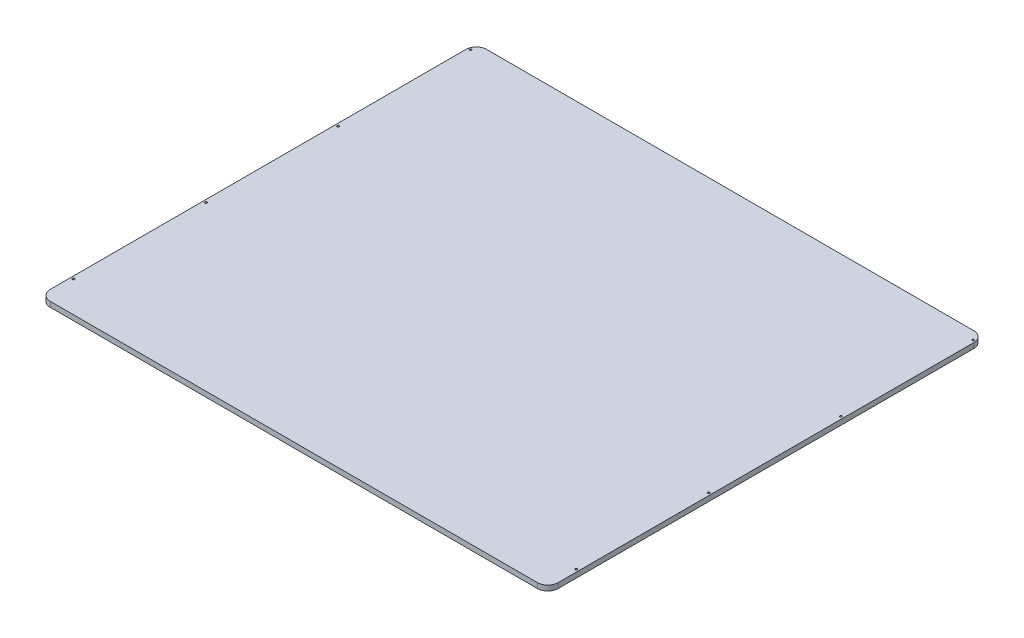
ISO-10303-21;
HEADER;
FILE_DESCRIPTION(('STEP AP214'),'2;1');
FILE_NAME('part.step','',(''),(''),'','','');
FILE_SCHEMA(('AUTOMOTIVE_DESIGN { 1 0 10303 214 1 1 1 1 }'));
ENDSEC;
DATA;
#1=APPLICATION_CONTEXT('core data for automotive mechanical design processes');
#2=APPLICATION_PROTOCOL_DEFINITION('international standard','automotive_design',2000,#1);
#3=PRODUCT_CONTEXT('',#1,'mechanical');
#4=PRODUCT('Part','Part','',(#3));
#5=PRODUCT_RELATED_PRODUCT_CATEGORY('part','',(#4));
#6=PRODUCT_DEFINITION_FORMATION('','',#4);
#7=PRODUCT_DEFINITION_CONTEXT('part definition',#1,'design');
#8=PRODUCT_DEFINITION('design','',#6,#7);
#9=PRODUCT_DEFINITION_SHAPE('','',#8);
#10=(LENGTH_UNIT() NAMED_UNIT(*) SI_UNIT(.MILLI.,.METRE.));
#11=(NAMED_UNIT(*) PLANE_ANGLE_UNIT() SI_UNIT($,.RADIAN.));
#12=(NAMED_UNIT(*) SI_UNIT($,.STERADIAN.) SOLID_ANGLE_UNIT());
#13=UNCERTAINTY_MEASURE_WITH_UNIT(LENGTH_MEASURE(1.E-05),#10,'distance_accuracy_value','');
#14=(GEOMETRIC_REPRESENTATION_CONTEXT(3) GLOBAL_UNCERTAINTY_ASSIGNED_CONTEXT((#13)) GLOBAL_UNIT_ASSIGNED_CONTEXT((#10,
#11,#12)) REPRESENTATION_CONTEXT('',''));
#15=CARTESIAN_POINT('',(0.,0.,0.));
#16=DIRECTION('',(0.,0.,1.));
#17=DIRECTION('',(1.,0.,0.));
#18=AXIS2_PLACEMENT_3D('',#15,#16,#17);
#19=CARTESIAN_POINT('',(0.,0.,0.));
#20=DIRECTION('',(0.,1.,0.));
#21=DIRECTION('',(0.,0.,1.));
#22=AXIS2_PLACEMENT_3D('',#19,#20,#21);
#23=PLANE('',#22);
#24=CARTESIAN_POINT('',(242.5,0.,-74.84));
#25=DIRECTION('',(0.,-1.,0.));
#26=DIRECTION('',(0.,0.,-1.));
#27=AXIS2_PLACEMENT_3D('',#24,#25,#26);
#28=CIRCLE('',#27,1.025);
#29=CARTESIAN_POINT('',(242.5,0.,-75.865));
#30=VERTEX_POINT('',#29);
#31=EDGE_CURVE('E218',#30,#30,#28,.T.);
#32=ORIENTED_EDGE('',*,*,#31,.F.);
#33=EDGE_LOOP('',(#32));
#34=FACE_BOUND('',#33,.T.);
#35=CARTESIAN_POINT('',(242.5,0.,52.83));
#36=DIRECTION('',(0.,-1.,0.));
#37=DIRECTION('',(0.,0.,-1.));
#38=AXIS2_PLACEMENT_3D('',#35,#36,#37);
#39=CIRCLE('',#38,1.025);
#40=CARTESIAN_POINT('',(242.5,0.,51.805));
#41=VERTEX_POINT('',#40);
#42=EDGE_CURVE('E212',#41,#41,#39,.T.);
#43=ORIENTED_EDGE('',*,*,#42,.F.);
#44=EDGE_LOOP('',(#43));
#45=FACE_BOUND('',#44,.T.);
#46=CARTESIAN_POINT('',(242.5,0.,180.5));
#47=DIRECTION('',(0.,-1.,0.));
#48=DIRECTION('',(0.,0.,-1.));
#49=AXIS2_PLACEMENT_3D('',#46,#47,#48);
#50=CIRCLE('',#49,1.025);
#51=CARTESIAN_POINT('',(242.5,0.,179.475));
#52=VERTEX_POINT('',#51);
#53=EDGE_CURVE('E206',#52,#52,#50,.T.);
#54=ORIENTED_EDGE('',*,*,#53,.F.);
#55=EDGE_LOOP('',(#54));
#56=FACE_BOUND('',#55,.T.);
#57=CARTESIAN_POINT('',(-242.5,0.,-202.51));
#58=DIRECTION('',(0.,-1.,0.));
#59=DIRECTION('',(0.,0.,-1.));
#60=AXIS2_PLACEMENT_3D('',#57,#58,#59);
#61=CIRCLE('',#60,1.025);
#62=CARTESIAN_POINT('',(-242.5,0.,-203.535));
#63=VERTEX_POINT('',#62);
#64=EDGE_CURVE('E200',#63,#63,#61,.T.);
#65=ORIENTED_EDGE('',*,*,#64,.F.);
#66=EDGE_LOOP('',(#65));
#67=FACE_BOUND('',#66,.T.);
#68=CARTESIAN_POINT('',(-242.5,0.,-74.84));
#69=DIRECTION('',(0.,-1.,0.));
#70=DIRECTION('',(0.,0.,-1.));
#71=AXIS2_PLACEMENT_3D('',#68,#69,#70);
#72=CIRCLE('',#71,1.025);
#73=CARTESIAN_POINT('',(-242.5,0.,-75.865));
#74=VERTEX_POINT('',#73);
#75=EDGE_CURVE('E194',#74,#74,#72,.T.);
#76=ORIENTED_EDGE('',*,*,#75,.F.);
#77=EDGE_LOOP('',(#76));
#78=FACE_BOUND('',#77,.T.);
#79=CARTESIAN_POINT('',(-242.5,0.,180.5));
#80=DIRECTION('',(0.,-1.,0.));
#81=DIRECTION('',(0.,0.,-1.));
#82=AXIS2_PLACEMENT_3D('',#79,#80,#81);
#83=CIRCLE('',#82,1.025);
#84=CARTESIAN_POINT('',(-242.5,0.,179.475));
#85=VERTEX_POINT('',#84);
#86=EDGE_CURVE('E177',#85,#85,#83,.T.);
#87=ORIENTED_EDGE('',*,*,#86,.F.);
#88=EDGE_LOOP('',(#87));
#89=FACE_BOUND('',#88,.T.);
#90=DIRECTION('',(0.,0.,-1.));
#91=VECTOR('',#90,1.);
#92=CARTESIAN_POINT('',(245.,0.,210.5));
#93=LINE('',#92,#91);
#94=CARTESIAN_POINT('',(245.,0.,200.5));
#95=VERTEX_POINT('',#94);
#96=CARTESIAN_POINT('',(245.,0.,-200.5));
#97=VERTEX_POINT('',#96);
#98=EDGE_CURVE('E118',#95,#97,#93,.T.);
#99=ORIENTED_EDGE('',*,*,#98,.F.);
#100=CARTESIAN_POINT('',(235.,0.,200.5));
#101=DIRECTION('',(0.,1.,0.));
#102=DIRECTION('',(0.,0.,1.));
#103=AXIS2_PLACEMENT_3D('',#100,#101,#102);
#104=CIRCLE('',#103,10.);
#105=CARTESIAN_POINT('',(235.,0.,210.5));
#106=VERTEX_POINT('',#105);
#107=EDGE_CURVE('E101',#95,#106,#104,.F.);
#108=ORIENTED_EDGE('',*,*,#107,.T.);
#109=DIRECTION('',(1.,0.,0.));
#110=VECTOR('',#109,1.);
#111=CARTESIAN_POINT('',(245.,0.,210.5));
#112=LINE('',#111,#110);
#113=CARTESIAN_POINT('',(-235.,0.,210.5));
#114=VERTEX_POINT('',#113);
#115=EDGE_CURVE('E128',#114,#106,#112,.T.);
#116=ORIENTED_EDGE('',*,*,#115,.F.);
#117=CARTESIAN_POINT('',(-235.,0.,200.5));
#118=DIRECTION('',(0.,1.,0.));
#119=DIRECTION('',(0.,0.,1.));
#120=AXIS2_PLACEMENT_3D('',#117,#118,#119);
#121=CIRCLE('',#120,10.);
#122=CARTESIAN_POINT('',(-245.,0.,200.5));
#123=VERTEX_POINT('',#122);
#124=EDGE_CURVE('E112',#114,#123,#121,.F.);
#125=ORIENTED_EDGE('',*,*,#124,.T.);
#126=DIRECTION('',(0.,0.,1.));
#127=VECTOR('',#126,1.);
#128=CARTESIAN_POINT('',(-245.,0.,210.5));
#129=LINE('',#128,#127);
#130=CARTESIAN_POINT('',(-245.,0.,-200.5));
#131=VERTEX_POINT('',#130);
#132=EDGE_CURVE('E132',#131,#123,#129,.T.);
#133=ORIENTED_EDGE('',*,*,#132,.F.);
#134=CARTESIAN_POINT('',(-235.,0.,-200.5));
#135=DIRECTION('',(0.,1.,0.));
#136=DIRECTION('',(0.,0.,1.));
#137=AXIS2_PLACEMENT_3D('',#134,#135,#136);
#138=CIRCLE('',#137,10.);
#139=CARTESIAN_POINT('',(-235.,0.,-210.5));
#140=VERTEX_POINT('',#139);
#141=EDGE_CURVE('E121',#131,#140,#138,.F.);
#142=ORIENTED_EDGE('',*,*,#141,.T.);
#143=DIRECTION('',(-1.,0.,0.));
#144=VECTOR('',#143,1.);
#145=CARTESIAN_POINT('',(245.,0.,-210.5));
#146=LINE('',#145,#144);
#147=CARTESIAN_POINT('',(235.,0.,-210.5));
#148=VERTEX_POINT('',#147);
#149=EDGE_CURVE('E127',#148,#140,#146,.T.);
#150=ORIENTED_EDGE('',*,*,#149,.F.);
#151=CARTESIAN_POINT('',(235.,0.,-200.5));
#152=DIRECTION('',(0.,1.,0.));
#153=DIRECTION('',(0.,0.,1.));
#154=AXIS2_PLACEMENT_3D('',#151,#152,#153);
#155=CIRCLE('',#154,10.);
#156=EDGE_CURVE('E126',#148,#97,#155,.F.);
#157=ORIENTED_EDGE('',*,*,#156,.T.);
#158=EDGE_LOOP('',(#99,#108,#116,#125,#133,#142,#150,#157));
#159=FACE_BOUND('',#158,.T.);
#160=CARTESIAN_POINT('',(-242.5,0.,52.83));
#161=DIRECTION('',(0.,-1.,0.));
#162=DIRECTION('',(0.,0.,-1.));
#163=AXIS2_PLACEMENT_3D('',#160,#161,#162);
#164=CIRCLE('',#163,1.025);
#165=CARTESIAN_POINT('',(-242.5,0.,51.805));
#166=VERTEX_POINT('',#165);
#167=EDGE_CURVE('E188',#166,#166,#164,.T.);
#168=ORIENTED_EDGE('',*,*,#167,.F.);
#169=EDGE_LOOP('',(#168));
#170=FACE_BOUND('',#169,.T.);
#171=CARTESIAN_POINT('',(242.5,0.,-202.51));
#172=DIRECTION('',(0.,-1.,0.));
#173=DIRECTION('',(0.,0.,-1.));
#174=AXIS2_PLACEMENT_3D('',#171,#172,#173);
#175=CIRCLE('',#174,1.025);
#176=CARTESIAN_POINT('',(242.5,0.,-203.535));
#177=VERTEX_POINT('',#176);
#178=EDGE_CURVE('E224',#177,#177,#175,.T.);
#179=ORIENTED_EDGE('',*,*,#178,.F.);
#180=EDGE_LOOP('',(#179));
#181=FACE_BOUND('',#180,.T.);
#182=ADVANCED_FACE('F35',(#34,#45,#56,#67,#78,#89,#159,#170,#181),#23,.F.);
#183=CARTESIAN_POINT('',(-245.,5.,210.5));
#184=DIRECTION('',(1.,0.,0.));
#185=DIRECTION('',(0.,0.,-1.));
#186=AXIS2_PLACEMENT_3D('',#183,#184,#185);
#187=PLANE('',#186);
#188=ORIENTED_EDGE('',*,*,#132,.T.);
#189=DIRECTION('',(0.,-1.,0.));
#190=VECTOR('',#189,1.);
#191=CARTESIAN_POINT('',(-245.,5.,200.5));
#192=LINE('',#191,#190);
#193=CARTESIAN_POINT('',(-245.,5.,200.5));
#194=VERTEX_POINT('',#193);
#195=EDGE_CURVE('E154',#123,#194,#192,.F.);
#196=ORIENTED_EDGE('',*,*,#195,.T.);
#197=DIRECTION('',(0.,0.,1.));
#198=VECTOR('',#197,1.);
#199=CARTESIAN_POINT('',(-245.,5.,210.5));
#200=LINE('',#199,#198);
#201=CARTESIAN_POINT('',(-245.,5.,-200.5));
#202=VERTEX_POINT('',#201);
#203=EDGE_CURVE('E130',#202,#194,#200,.T.);
#204=ORIENTED_EDGE('',*,*,#203,.F.);
#205=DIRECTION('',(0.,-1.,0.));
#206=VECTOR('',#205,1.);
#207=CARTESIAN_POINT('',(-245.,5.,-200.5));
#208=LINE('',#207,#206);
#209=EDGE_CURVE('E151',#202,#131,#208,.T.);
#210=ORIENTED_EDGE('',*,*,#209,.T.);
#211=EDGE_LOOP('',(#188,#196,#204,#210));
#212=FACE_BOUND('',#211,.T.);
#213=ADVANCED_FACE('F160',(#212),#187,.F.);
#214=CARTESIAN_POINT('',(245.,5.,210.5));
#215=DIRECTION('',(0.,0.,-1.));
#216=DIRECTION('',(-1.,0.,0.));
#217=AXIS2_PLACEMENT_3D('',#214,#215,#216);
#218=PLANE('',#217);
#219=ORIENTED_EDGE('',*,*,#115,.T.);
#220=DIRECTION('',(0.,-1.,0.));
#221=VECTOR('',#220,1.);
#222=CARTESIAN_POINT('',(235.,5.,210.5));
#223=LINE('',#222,#221);
#224=CARTESIAN_POINT('',(235.,5.,210.5));
#225=VERTEX_POINT('',#224);
#226=EDGE_CURVE('E106',#106,#225,#223,.F.);
#227=ORIENTED_EDGE('',*,*,#226,.T.);
#228=DIRECTION('',(1.,0.,0.));
#229=VECTOR('',#228,1.);
#230=CARTESIAN_POINT('',(245.,5.,210.5));
#231=LINE('',#230,#229);
#232=CARTESIAN_POINT('',(-235.,5.,210.5));
#233=VERTEX_POINT('',#232);
#234=EDGE_CURVE('E169',#233,#225,#231,.T.);
#235=ORIENTED_EDGE('',*,*,#234,.F.);
#236=DIRECTION('',(0.,-1.,0.));
#237=VECTOR('',#236,1.);
#238=CARTESIAN_POINT('',(-235.,5.,210.5));
#239=LINE('',#238,#237);
#240=EDGE_CURVE('E111',#233,#114,#239,.T.);
#241=ORIENTED_EDGE('',*,*,#240,.T.);
#242=EDGE_LOOP('',(#219,#227,#235,#241));
#243=FACE_BOUND('',#242,.T.);
#244=ADVANCED_FACE('F174',(#243),#218,.F.);
#245=CARTESIAN_POINT('',(245.,5.,210.5));
#246=DIRECTION('',(-1.,0.,0.));
#247=DIRECTION('',(0.,0.,1.));
#248=AXIS2_PLACEMENT_3D('',#245,#246,#247);
#249=PLANE('',#248);
#250=DIRECTION('',(0.,0.,-1.));
#251=VECTOR('',#250,1.);
#252=CARTESIAN_POINT('',(245.,5.,210.5));
#253=LINE('',#252,#251);
#254=CARTESIAN_POINT('',(245.,5.,200.5));
#255=VERTEX_POINT('',#254);
#256=CARTESIAN_POINT('',(245.,5.,-200.5));
#257=VERTEX_POINT('',#256);
#258=EDGE_CURVE('E120',#255,#257,#253,.T.);
#259=ORIENTED_EDGE('',*,*,#258,.F.);
#260=DIRECTION('',(0.,-1.,0.));
#261=VECTOR('',#260,1.);
#262=CARTESIAN_POINT('',(245.,5.,200.5));
#263=LINE('',#262,#261);
#264=EDGE_CURVE('E105',#255,#95,#263,.T.);
#265=ORIENTED_EDGE('',*,*,#264,.T.);
#266=ORIENTED_EDGE('',*,*,#98,.T.);
#267=DIRECTION('',(0.,-1.,0.));
#268=VECTOR('',#267,1.);
#269=CARTESIAN_POINT('',(245.,5.,-200.5));
#270=LINE('',#269,#268);
#271=EDGE_CURVE('E122',#97,#257,#270,.F.);
#272=ORIENTED_EDGE('',*,*,#271,.T.);
#273=EDGE_LOOP('',(#259,#265,#266,#272));
#274=FACE_BOUND('',#273,.T.);
#275=ADVANCED_FACE('F117',(#274),#249,.F.);
#276=CARTESIAN_POINT('',(245.,5.,-210.5));
#277=DIRECTION('',(0.,0.,1.));
#278=DIRECTION('',(1.,0.,0.));
#279=AXIS2_PLACEMENT_3D('',#276,#277,#278);
#280=PLANE('',#279);
#281=DIRECTION('',(-1.,0.,0.));
#282=VECTOR('',#281,1.);
#283=CARTESIAN_POINT('',(245.,5.,-210.5));
#284=LINE('',#283,#282);
#285=CARTESIAN_POINT('',(235.,5.,-210.5));
#286=VERTEX_POINT('',#285);
#287=CARTESIAN_POINT('',(-235.,5.,-210.5));
#288=VERTEX_POINT('',#287);
#289=EDGE_CURVE('E136',#286,#288,#284,.T.);
#290=ORIENTED_EDGE('',*,*,#289,.F.);
#291=DIRECTION('',(0.,-1.,0.));
#292=VECTOR('',#291,1.);
#293=CARTESIAN_POINT('',(235.,5.,-210.5));
#294=LINE('',#293,#292);
#295=EDGE_CURVE('E11',#286,#148,#294,.T.);
#296=ORIENTED_EDGE('',*,*,#295,.T.);
#297=ORIENTED_EDGE('',*,*,#149,.T.);
#298=DIRECTION('',(0.,-1.,0.));
#299=VECTOR('',#298,1.);
#300=CARTESIAN_POINT('',(-235.,5.,-210.5));
#301=LINE('',#300,#299);
#302=EDGE_CURVE('E43',#140,#288,#301,.F.);
#303=ORIENTED_EDGE('',*,*,#302,.T.);
#304=EDGE_LOOP('',(#290,#296,#297,#303));
#305=FACE_BOUND('',#304,.T.);
#306=ADVANCED_FACE('F242',(#305),#280,.F.);
#307=CARTESIAN_POINT('',(0.,5.,0.));
#308=DIRECTION('',(0.,1.,0.));
#309=DIRECTION('',(0.,0.,1.));
#310=AXIS2_PLACEMENT_3D('',#307,#308,#309);
#311=PLANE('',#310);
#312=CARTESIAN_POINT('',(242.5,5.,-202.51));
#313=DIRECTION('',(0.,-1.,0.));
#314=DIRECTION('',(0.,0.,-1.));
#315=AXIS2_PLACEMENT_3D('',#312,#313,#314);
#316=CIRCLE('',#315,1.025);
#317=CARTESIAN_POINT('',(242.5,5.,-203.535));
#318=VERTEX_POINT('',#317);
#319=EDGE_CURVE('E221',#318,#318,#316,.T.);
#320=ORIENTED_EDGE('',*,*,#319,.T.);
#321=EDGE_LOOP('',(#320));
#322=FACE_BOUND('',#321,.T.);
#323=CARTESIAN_POINT('',(242.5,5.,-74.84));
#324=DIRECTION('',(0.,-1.,0.));
#325=DIRECTION('',(0.,0.,-1.));
#326=AXIS2_PLACEMENT_3D('',#323,#324,#325);
#327=CIRCLE('',#326,1.025);
#328=CARTESIAN_POINT('',(242.5,5.,-75.865));
#329=VERTEX_POINT('',#328);
#330=EDGE_CURVE('E215',#329,#329,#327,.T.);
#331=ORIENTED_EDGE('',*,*,#330,.T.);
#332=EDGE_LOOP('',(#331));
#333=FACE_BOUND('',#332,.T.);
#334=CARTESIAN_POINT('',(242.5,5.,52.83));
#335=DIRECTION('',(0.,-1.,0.));
#336=DIRECTION('',(0.,0.,-1.));
#337=AXIS2_PLACEMENT_3D('',#334,#335,#336);
#338=CIRCLE('',#337,1.025);
#339=CARTESIAN_POINT('',(242.5,5.,51.805));
#340=VERTEX_POINT('',#339);
#341=EDGE_CURVE('E209',#340,#340,#338,.T.);
#342=ORIENTED_EDGE('',*,*,#341,.T.);
#343=EDGE_LOOP('',(#342));
#344=FACE_BOUND('',#343,.T.);
#345=CARTESIAN_POINT('',(242.5,5.,180.5));
#346=DIRECTION('',(0.,-1.,0.));
#347=DIRECTION('',(0.,0.,-1.));
#348=AXIS2_PLACEMENT_3D('',#345,#346,#347);
#349=CIRCLE('',#348,1.025);
#350=CARTESIAN_POINT('',(242.5,5.,179.475));
#351=VERTEX_POINT('',#350);
#352=EDGE_CURVE('E203',#351,#351,#349,.T.);
#353=ORIENTED_EDGE('',*,*,#352,.T.);
#354=EDGE_LOOP('',(#353));
#355=FACE_BOUND('',#354,.T.);
#356=CARTESIAN_POINT('',(-242.5,5.,-202.51));
#357=DIRECTION('',(0.,-1.,0.));
#358=DIRECTION('',(0.,0.,-1.));
#359=AXIS2_PLACEMENT_3D('',#356,#357,#358);
#360=CIRCLE('',#359,1.025);
#361=CARTESIAN_POINT('',(-242.5,5.,-203.535));
#362=VERTEX_POINT('',#361);
#363=EDGE_CURVE('E197',#362,#362,#360,.T.);
#364=ORIENTED_EDGE('',*,*,#363,.T.);
#365=EDGE_LOOP('',(#364));
#366=FACE_BOUND('',#365,.T.);
#367=CARTESIAN_POINT('',(-242.5,5.,-74.84));
#368=DIRECTION('',(0.,-1.,0.));
#369=DIRECTION('',(0.,0.,-1.));
#370=AXIS2_PLACEMENT_3D('',#367,#368,#369);
#371=CIRCLE('',#370,1.025);
#372=CARTESIAN_POINT('',(-242.5,5.,-75.865));
#373=VERTEX_POINT('',#372);
#374=EDGE_CURVE('E191',#373,#373,#371,.T.);
#375=ORIENTED_EDGE('',*,*,#374,.T.);
#376=EDGE_LOOP('',(#375));
#377=FACE_BOUND('',#376,.T.);
#378=CARTESIAN_POINT('',(-242.5,5.,52.83));
#379=DIRECTION('',(0.,-1.,0.));
#380=DIRECTION('',(0.,0.,-1.));
#381=AXIS2_PLACEMENT_3D('',#378,#379,#380);
#382=CIRCLE('',#381,1.025);
#383=CARTESIAN_POINT('',(-242.5,5.,51.805));
#384=VERTEX_POINT('',#383);
#385=EDGE_CURVE('E185',#384,#384,#382,.T.);
#386=ORIENTED_EDGE('',*,*,#385,.T.);
#387=EDGE_LOOP('',(#386));
#388=FACE_BOUND('',#387,.T.);
#389=CARTESIAN_POINT('',(-242.5,5.,180.5));
#390=DIRECTION('',(0.,-1.,0.));
#391=DIRECTION('',(0.,0.,-1.));
#392=AXIS2_PLACEMENT_3D('',#389,#390,#391);
#393=CIRCLE('',#392,1.025);
#394=CARTESIAN_POINT('',(-242.5,5.,179.475));
#395=VERTEX_POINT('',#394);
#396=EDGE_CURVE('E175',#395,#395,#393,.T.);
#397=ORIENTED_EDGE('',*,*,#396,.T.);
#398=EDGE_LOOP('',(#397));
#399=FACE_BOUND('',#398,.T.);
#400=ORIENTED_EDGE('',*,*,#234,.T.);
#401=CARTESIAN_POINT('',(235.,5.,200.5));
#402=DIRECTION('',(0.,1.,0.));
#403=DIRECTION('',(0.,0.,1.));
#404=AXIS2_PLACEMENT_3D('',#401,#402,#403);
#405=CIRCLE('',#404,10.);
#406=EDGE_CURVE('E149',#225,#255,#405,.T.);
#407=ORIENTED_EDGE('',*,*,#406,.T.);
#408=ORIENTED_EDGE('',*,*,#258,.T.);
#409=CARTESIAN_POINT('',(235.,5.,-200.5));
#410=DIRECTION('',(0.,1.,0.));
#411=DIRECTION('',(0.,0.,1.));
#412=AXIS2_PLACEMENT_3D('',#409,#410,#411);
#413=CIRCLE('',#412,10.);
#414=EDGE_CURVE('E56',#257,#286,#413,.T.);
#415=ORIENTED_EDGE('',*,*,#414,.T.);
#416=ORIENTED_EDGE('',*,*,#289,.T.);
#417=CARTESIAN_POINT('',(-235.,5.,-200.5));
#418=DIRECTION('',(0.,1.,0.));
#419=DIRECTION('',(0.,0.,1.));
#420=AXIS2_PLACEMENT_3D('',#417,#418,#419);
#421=CIRCLE('',#420,10.);
#422=EDGE_CURVE('E144',#288,#202,#421,.T.);
#423=ORIENTED_EDGE('',*,*,#422,.T.);
#424=ORIENTED_EDGE('',*,*,#203,.T.);
#425=CARTESIAN_POINT('',(-235.,5.,200.5));
#426=DIRECTION('',(0.,1.,0.));
#427=DIRECTION('',(0.,0.,1.));
#428=AXIS2_PLACEMENT_3D('',#425,#426,#427);
#429=CIRCLE('',#428,10.);
#430=EDGE_CURVE('E147',#194,#233,#429,.T.);
#431=ORIENTED_EDGE('',*,*,#430,.T.);
#432=EDGE_LOOP('',(#400,#407,#408,#415,#416,#423,#424,#431));
#433=FACE_BOUND('',#432,.T.);
#434=ADVANCED_FACE('F166',(#322,#333,#344,#355,#366,#377,#388,#399,#433),#311,.T.);
#435=CARTESIAN_POINT('',(235.,5.,200.5));
#436=DIRECTION('',(0.,-1.,0.));
#437=DIRECTION('',(0.,0.,-1.));
#438=AXIS2_PLACEMENT_3D('',#435,#436,#437);
#439=CYLINDRICAL_SURFACE('',#438,10.);
#440=ORIENTED_EDGE('',*,*,#406,.F.);
#441=ORIENTED_EDGE('',*,*,#226,.F.);
#442=ORIENTED_EDGE('',*,*,#107,.F.);
#443=ORIENTED_EDGE('',*,*,#264,.F.);
#444=EDGE_LOOP('',(#440,#441,#442,#443));
#445=FACE_BOUND('',#444,.T.);
#446=ADVANCED_FACE('F104',(#445),#439,.T.);
#447=CARTESIAN_POINT('',(-235.,5.,200.5));
#448=DIRECTION('',(0.,-1.,0.));
#449=DIRECTION('',(0.,0.,-1.));
#450=AXIS2_PLACEMENT_3D('',#447,#448,#449);
#451=CYLINDRICAL_SURFACE('',#450,10.);
#452=ORIENTED_EDGE('',*,*,#430,.F.);
#453=ORIENTED_EDGE('',*,*,#195,.F.);
#454=ORIENTED_EDGE('',*,*,#124,.F.);
#455=ORIENTED_EDGE('',*,*,#240,.F.);
#456=EDGE_LOOP('',(#452,#453,#454,#455));
#457=FACE_BOUND('',#456,.T.);
#458=ADVANCED_FACE('F172',(#457),#451,.T.);
#459=CARTESIAN_POINT('',(235.,5.,-200.5));
#460=DIRECTION('',(0.,-1.,0.));
#461=DIRECTION('',(0.,0.,-1.));
#462=AXIS2_PLACEMENT_3D('',#459,#460,#461);
#463=CYLINDRICAL_SURFACE('',#462,10.);
#464=ORIENTED_EDGE('',*,*,#414,.F.);
#465=ORIENTED_EDGE('',*,*,#271,.F.);
#466=ORIENTED_EDGE('',*,*,#156,.F.);
#467=ORIENTED_EDGE('',*,*,#295,.F.);
#468=EDGE_LOOP('',(#464,#465,#466,#467));
#469=FACE_BOUND('',#468,.T.);
#470=ADVANCED_FACE('F252',(#469),#463,.T.);
#471=CARTESIAN_POINT('',(-235.,5.,-200.5));
#472=DIRECTION('',(0.,-1.,0.));
#473=DIRECTION('',(0.,0.,-1.));
#474=AXIS2_PLACEMENT_3D('',#471,#472,#473);
#475=CYLINDRICAL_SURFACE('',#474,10.);
#476=ORIENTED_EDGE('',*,*,#422,.F.);
#477=ORIENTED_EDGE('',*,*,#302,.F.);
#478=ORIENTED_EDGE('',*,*,#141,.F.);
#479=ORIENTED_EDGE('',*,*,#209,.F.);
#480=EDGE_LOOP('',(#476,#477,#478,#479));
#481=FACE_BOUND('',#480,.T.);
#482=ADVANCED_FACE('F37',(#481),#475,.T.);
#483=CARTESIAN_POINT('',(-242.5,0.,180.5));
#484=DIRECTION('',(0.,-1.,0.));
#485=DIRECTION('',(0.,0.,-1.));
#486=AXIS2_PLACEMENT_3D('',#483,#484,#485);
#487=CYLINDRICAL_SURFACE('',#486,1.025);
#488=ORIENTED_EDGE('',*,*,#396,.F.);
#489=EDGE_LOOP('',(#488));
#490=FACE_BOUND('',#489,.T.);
#491=ORIENTED_EDGE('',*,*,#86,.T.);
#492=EDGE_LOOP('',(#491));
#493=FACE_BOUND('',#492,.T.);
#494=ADVANCED_FACE('F258',(#490,#493),#487,.F.);
#495=CARTESIAN_POINT('',(-242.5,0.,52.83));
#496=DIRECTION('',(0.,-1.,0.));
#497=DIRECTION('',(0.,0.,-1.));
#498=AXIS2_PLACEMENT_3D('',#495,#496,#497);
#499=CYLINDRICAL_SURFACE('',#498,1.025);
#500=ORIENTED_EDGE('',*,*,#385,.F.);
#501=EDGE_LOOP('',(#500));
#502=FACE_BOUND('',#501,.T.);
#503=ORIENTED_EDGE('',*,*,#167,.T.);
#504=EDGE_LOOP('',(#503));
#505=FACE_BOUND('',#504,.T.);
#506=ADVANCED_FACE('F264',(#502,#505),#499,.F.);
#507=CARTESIAN_POINT('',(-242.5,0.,-74.84));
#508=DIRECTION('',(0.,-1.,0.));
#509=DIRECTION('',(0.,0.,-1.));
#510=AXIS2_PLACEMENT_3D('',#507,#508,#509);
#511=CYLINDRICAL_SURFACE('',#510,1.025);
#512=ORIENTED_EDGE('',*,*,#374,.F.);
#513=EDGE_LOOP('',(#512));
#514=FACE_BOUND('',#513,.T.);
#515=ORIENTED_EDGE('',*,*,#75,.T.);
#516=EDGE_LOOP('',(#515));
#517=FACE_BOUND('',#516,.T.);
#518=ADVANCED_FACE('F269',(#514,#517),#511,.F.);
#519=CARTESIAN_POINT('',(-242.5,0.,-202.51));
#520=DIRECTION('',(0.,-1.,0.));
#521=DIRECTION('',(0.,0.,-1.));
#522=AXIS2_PLACEMENT_3D('',#519,#520,#521);
#523=CYLINDRICAL_SURFACE('',#522,1.025);
#524=ORIENTED_EDGE('',*,*,#363,.F.);
#525=EDGE_LOOP('',(#524));
#526=FACE_BOUND('',#525,.T.);
#527=ORIENTED_EDGE('',*,*,#64,.T.);
#528=EDGE_LOOP('',(#527));
#529=FACE_BOUND('',#528,.T.);
#530=ADVANCED_FACE('F277',(#526,#529),#523,.F.);
#531=CARTESIAN_POINT('',(242.5,0.,180.5));
#532=DIRECTION('',(0.,-1.,0.));
#533=DIRECTION('',(0.,0.,-1.));
#534=AXIS2_PLACEMENT_3D('',#531,#532,#533);
#535=CYLINDRICAL_SURFACE('',#534,1.025);
#536=ORIENTED_EDGE('',*,*,#352,.F.);
#537=EDGE_LOOP('',(#536));
#538=FACE_BOUND('',#537,.T.);
#539=ORIENTED_EDGE('',*,*,#53,.T.);
#540=EDGE_LOOP('',(#539));
#541=FACE_BOUND('',#540,.T.);
#542=ADVANCED_FACE('F281',(#538,#541),#535,.F.);
#543=CARTESIAN_POINT('',(242.5,0.,52.83));
#544=DIRECTION('',(0.,-1.,0.));
#545=DIRECTION('',(0.,0.,-1.));
#546=AXIS2_PLACEMENT_3D('',#543,#544,#545);
#547=CYLINDRICAL_SURFACE('',#546,1.025);
#548=ORIENTED_EDGE('',*,*,#341,.F.);
#549=EDGE_LOOP('',(#548));
#550=FACE_BOUND('',#549,.T.);
#551=ORIENTED_EDGE('',*,*,#42,.T.);
#552=EDGE_LOOP('',(#551));
#553=FACE_BOUND('',#552,.T.);
#554=ADVANCED_FACE('F285',(#550,#553),#547,.F.);
#555=CARTESIAN_POINT('',(242.5,0.,-74.84));
#556=DIRECTION('',(0.,-1.,0.));
#557=DIRECTION('',(0.,0.,-1.));
#558=AXIS2_PLACEMENT_3D('',#555,#556,#557);
#559=CYLINDRICAL_SURFACE('',#558,1.025);
#560=ORIENTED_EDGE('',*,*,#330,.F.);
#561=EDGE_LOOP('',(#560));
#562=FACE_BOUND('',#561,.T.);
#563=ORIENTED_EDGE('',*,*,#31,.T.);
#564=EDGE_LOOP('',(#563));
#565=FACE_BOUND('',#564,.T.);
#566=ADVANCED_FACE('F289',(#562,#565),#559,.F.);
#567=CARTESIAN_POINT('',(242.5,0.,-202.51));
#568=DIRECTION('',(0.,-1.,0.));
#569=DIRECTION('',(0.,0.,-1.));
#570=AXIS2_PLACEMENT_3D('',#567,#568,#569);
#571=CYLINDRICAL_SURFACE('',#570,1.025);
#572=ORIENTED_EDGE('',*,*,#319,.F.);
#573=EDGE_LOOP('',(#572));
#574=FACE_BOUND('',#573,.T.);
#575=ORIENTED_EDGE('',*,*,#178,.T.);
#576=EDGE_LOOP('',(#575));
#577=FACE_BOUND('',#576,.T.);
#578=ADVANCED_FACE('F228',(#574,#577),#571,.F.);
#579=CLOSED_SHELL('',(#182,#213,#244,#275,#306,#434,#446,#458,#470,#482,#494,#506,#518,#530,
#542,#554,#566,#578));
#580=MANIFOLD_SOLID_BREP('B2',#579);
#581=ADVANCED_BREP_SHAPE_REPRESENTATION('',(#18,#580),#14);
#582=SHAPE_DEFINITION_REPRESENTATION(#9,#581);
ENDSEC;
END-ISO-10303-21;
